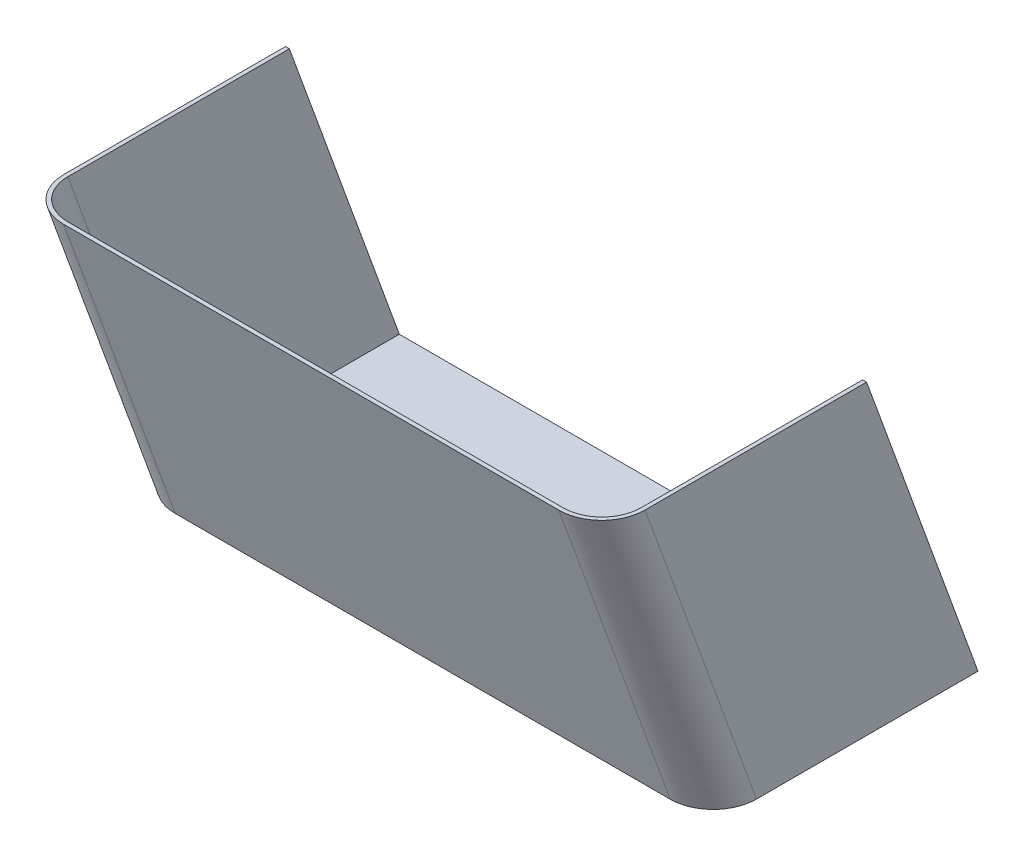
ISO-10303-21;
HEADER;
FILE_DESCRIPTION(('STEP AP214'),'2;1');
FILE_NAME('part.step','',(''),(''),'','','');
FILE_SCHEMA(('AUTOMOTIVE_DESIGN { 1 0 10303 214 1 1 1 1 }'));
ENDSEC;
DATA;
#1=APPLICATION_CONTEXT('core data for automotive mechanical design processes');
#2=APPLICATION_PROTOCOL_DEFINITION('international standard','automotive_design',2000,#1);
#3=PRODUCT_CONTEXT('',#1,'mechanical');
#4=PRODUCT('Part','Part','',(#3));
#5=PRODUCT_RELATED_PRODUCT_CATEGORY('part','',(#4));
#6=PRODUCT_DEFINITION_FORMATION('','',#4);
#7=PRODUCT_DEFINITION_CONTEXT('part definition',#1,'design');
#8=PRODUCT_DEFINITION('design','',#6,#7);
#9=PRODUCT_DEFINITION_SHAPE('','',#8);
#10=(LENGTH_UNIT() NAMED_UNIT(*) SI_UNIT(.MILLI.,.METRE.));
#11=(NAMED_UNIT(*) PLANE_ANGLE_UNIT() SI_UNIT($,.RADIAN.));
#12=(NAMED_UNIT(*) SI_UNIT($,.STERADIAN.) SOLID_ANGLE_UNIT());
#13=UNCERTAINTY_MEASURE_WITH_UNIT(LENGTH_MEASURE(1.E-05),#10,'distance_accuracy_value','');
#14=(GEOMETRIC_REPRESENTATION_CONTEXT(3) GLOBAL_UNCERTAINTY_ASSIGNED_CONTEXT((#13)) GLOBAL_UNIT_ASSIGNED_CONTEXT((#10,
#11,#12)) REPRESENTATION_CONTEXT('',''));
#15=CARTESIAN_POINT('',(0.,0.,0.));
#16=DIRECTION('',(0.,0.,1.));
#17=DIRECTION('',(1.,0.,0.));
#18=AXIS2_PLACEMENT_3D('',#15,#16,#17);
#19=CARTESIAN_POINT('',(220.,3.,70.));
#20=DIRECTION('',(-1.,0.,0.));
#21=DIRECTION('',(0.,0.,1.));
#22=AXIS2_PLACEMENT_3D('',#19,#20,#21);
#23=PLANE('',#22);
#24=DIRECTION('',(0.,0.,-1.));
#25=VECTOR('',#24,1.);
#26=CARTESIAN_POINT('',(220.,0.,70.));
#27=LINE('',#26,#25);
#28=CARTESIAN_POINT('',(220.,0.,70.));
#29=VERTEX_POINT('',#28);
#30=CARTESIAN_POINT('',(220.,0.,-100.));
#31=VERTEX_POINT('',#30);
#32=EDGE_CURVE('E124',#29,#31,#27,.T.);
#33=ORIENTED_EDGE('',*,*,#32,.T.);
#34=DIRECTION('',(0.,0.939692620785909,0.342020143325666));
#35=VECTOR('',#34,1.);
#36=CARTESIAN_POINT('',(220.,57.286013488034,-79.1495962505837));
#37=LINE('',#36,#35);
#38=CARTESIAN_POINT('',(220.,3.,-98.9080892972014));
#39=VERTEX_POINT('',#38);
#40=EDGE_CURVE('E118',#31,#39,#37,.T.);
#41=ORIENTED_EDGE('',*,*,#40,.T.);
#42=DIRECTION('',(0.,0.,-1.));
#43=VECTOR('',#42,1.);
#44=CARTESIAN_POINT('',(220.,3.,70.));
#45=LINE('',#44,#43);
#46=CARTESIAN_POINT('',(220.,3.,70.));
#47=VERTEX_POINT('',#46);
#48=EDGE_CURVE('E139',#47,#39,#45,.T.);
#49=ORIENTED_EDGE('',*,*,#48,.F.);
#50=DIRECTION('',(0.,-1.,0.));
#51=VECTOR('',#50,1.);
#52=CARTESIAN_POINT('',(220.,3.,70.));
#53=LINE('',#52,#51);
#54=EDGE_CURVE('E140',#47,#29,#53,.T.);
#55=ORIENTED_EDGE('',*,*,#54,.T.);
#56=EDGE_LOOP('',(#33,#41,#49,#55));
#57=FACE_BOUND('',#56,.T.);
#58=ADVANCED_FACE('F51',(#57),#23,.F.);
#59=CARTESIAN_POINT('',(-220.,3.,70.));
#60=DIRECTION('',(1.,0.,0.));
#61=DIRECTION('',(0.,0.,-1.));
#62=AXIS2_PLACEMENT_3D('',#59,#60,#61);
#63=PLANE('',#62);
#64=DIRECTION('',(0.,0.,1.));
#65=VECTOR('',#64,1.);
#66=CARTESIAN_POINT('',(-220.,3.,70.));
#67=LINE('',#66,#65);
#68=CARTESIAN_POINT('',(-220.,3.,-98.9080892972014));
#69=VERTEX_POINT('',#68);
#70=CARTESIAN_POINT('',(-220.,3.,70.));
#71=VERTEX_POINT('',#70);
#72=EDGE_CURVE('E101',#69,#71,#67,.T.);
#73=ORIENTED_EDGE('',*,*,#72,.F.);
#74=DIRECTION('',(0.,-0.939692620785909,-0.342020143325666));
#75=VECTOR('',#74,1.);
#76=CARTESIAN_POINT('',(-220.,57.286013488034,-79.1495962505837));
#77=LINE('',#76,#75);
#78=CARTESIAN_POINT('',(-220.,0.,-100.));
#79=VERTEX_POINT('',#78);
#80=EDGE_CURVE('E116',#69,#79,#77,.T.);
#81=ORIENTED_EDGE('',*,*,#80,.T.);
#82=DIRECTION('',(0.,0.,1.));
#83=VECTOR('',#82,1.);
#84=CARTESIAN_POINT('',(-220.,0.,70.));
#85=LINE('',#84,#83);
#86=CARTESIAN_POINT('',(-220.,0.,70.));
#87=VERTEX_POINT('',#86);
#88=EDGE_CURVE('E123',#79,#87,#85,.T.);
#89=ORIENTED_EDGE('',*,*,#88,.T.);
#90=DIRECTION('',(0.,-1.,0.));
#91=VECTOR('',#90,1.);
#92=CARTESIAN_POINT('',(-220.,3.,70.));
#93=LINE('',#92,#91);
#94=EDGE_CURVE('E12',#71,#87,#93,.T.);
#95=ORIENTED_EDGE('',*,*,#94,.F.);
#96=EDGE_LOOP('',(#73,#81,#89,#95));
#97=FACE_BOUND('',#96,.T.);
#98=ADVANCED_FACE('F127',(#97),#63,.F.);
#99=CARTESIAN_POINT('',(-190.,3.,70.));
#100=DIRECTION('',(0.,-1.,0.));
#101=DIRECTION('',(0.,0.,-1.));
#102=AXIS2_PLACEMENT_3D('',#99,#100,#101);
#103=CYLINDRICAL_SURFACE('',#102,30.);
#104=CARTESIAN_POINT('',(-190.,0.,70.));
#105=DIRECTION('',(0.,1.,0.));
#106=DIRECTION('',(0.,0.,-1.));
#107=AXIS2_PLACEMENT_3D('',#104,#105,#106);
#108=CIRCLE('',#107,30.);
#109=CARTESIAN_POINT('',(-190.,0.,100.));
#110=VERTEX_POINT('',#109);
#111=EDGE_CURVE('E132',#87,#110,#108,.T.);
#112=ORIENTED_EDGE('',*,*,#111,.T.);
#113=DIRECTION('',(0.,-1.,0.));
#114=VECTOR('',#113,1.);
#115=CARTESIAN_POINT('',(-190.,3.,100.));
#116=LINE('',#115,#114);
#117=CARTESIAN_POINT('',(-190.,3.,100.));
#118=VERTEX_POINT('',#117);
#119=EDGE_CURVE('E59',#118,#110,#116,.T.);
#120=ORIENTED_EDGE('',*,*,#119,.F.);
#121=CARTESIAN_POINT('',(-190.,3.,70.));
#122=DIRECTION('',(0.,1.,0.));
#123=DIRECTION('',(0.,0.,-1.));
#124=AXIS2_PLACEMENT_3D('',#121,#122,#123);
#125=CIRCLE('',#124,30.);
#126=EDGE_CURVE('E154',#71,#118,#125,.T.);
#127=ORIENTED_EDGE('',*,*,#126,.F.);
#128=ORIENTED_EDGE('',*,*,#94,.T.);
#129=EDGE_LOOP('',(#112,#120,#127,#128));
#130=FACE_BOUND('',#129,.T.);
#131=ADVANCED_FACE('F169',(#130),#103,.T.);
#132=CARTESIAN_POINT('',(-190.,3.,100.));
#133=DIRECTION('',(0.,0.,-1.));
#134=DIRECTION('',(-1.,0.,0.));
#135=AXIS2_PLACEMENT_3D('',#132,#133,#134);
#136=PLANE('',#135);
#137=DIRECTION('',(1.,0.,0.));
#138=VECTOR('',#137,1.);
#139=CARTESIAN_POINT('',(-190.,0.,100.));
#140=LINE('',#139,#138);
#141=CARTESIAN_POINT('',(190.,0.,100.));
#142=VERTEX_POINT('',#141);
#143=EDGE_CURVE('E88',#110,#142,#140,.T.);
#144=ORIENTED_EDGE('',*,*,#143,.T.);
#145=DIRECTION('',(0.,-1.,0.));
#146=VECTOR('',#145,1.);
#147=CARTESIAN_POINT('',(190.,3.,100.));
#148=LINE('',#147,#146);
#149=CARTESIAN_POINT('',(190.,3.,100.));
#150=VERTEX_POINT('',#149);
#151=EDGE_CURVE('E142',#150,#142,#148,.T.);
#152=ORIENTED_EDGE('',*,*,#151,.F.);
#153=DIRECTION('',(1.,0.,0.));
#154=VECTOR('',#153,1.);
#155=CARTESIAN_POINT('',(-190.,3.,100.));
#156=LINE('',#155,#154);
#157=EDGE_CURVE('E146',#118,#150,#156,.T.);
#158=ORIENTED_EDGE('',*,*,#157,.F.);
#159=ORIENTED_EDGE('',*,*,#119,.T.);
#160=EDGE_LOOP('',(#144,#152,#158,#159));
#161=FACE_BOUND('',#160,.T.);
#162=ADVANCED_FACE('F145',(#161),#136,.F.);
#163=CARTESIAN_POINT('',(190.,3.,70.));
#164=DIRECTION('',(0.,-1.,0.));
#165=DIRECTION('',(0.,0.,-1.));
#166=AXIS2_PLACEMENT_3D('',#163,#164,#165);
#167=CYLINDRICAL_SURFACE('',#166,30.);
#168=CARTESIAN_POINT('',(190.,0.,70.));
#169=DIRECTION('',(0.,1.,0.));
#170=DIRECTION('',(0.,0.,-1.));
#171=AXIS2_PLACEMENT_3D('',#168,#169,#170);
#172=CIRCLE('',#171,30.);
#173=EDGE_CURVE('E94',#142,#29,#172,.T.);
#174=ORIENTED_EDGE('',*,*,#173,.T.);
#175=ORIENTED_EDGE('',*,*,#54,.F.);
#176=CARTESIAN_POINT('',(190.,3.,70.));
#177=DIRECTION('',(0.,1.,0.));
#178=DIRECTION('',(0.,0.,-1.));
#179=AXIS2_PLACEMENT_3D('',#176,#177,#178);
#180=CIRCLE('',#179,30.);
#181=EDGE_CURVE('E67',#150,#47,#180,.T.);
#182=ORIENTED_EDGE('',*,*,#181,.F.);
#183=ORIENTED_EDGE('',*,*,#151,.T.);
#184=EDGE_LOOP('',(#174,#175,#182,#183));
#185=FACE_BOUND('',#184,.T.);
#186=ADVANCED_FACE('F160',(#185),#167,.T.);
#187=CARTESIAN_POINT('',(-190.,3.,70.));
#188=DIRECTION('',(0.,-1.,0.));
#189=DIRECTION('',(0.,0.,-1.));
#190=AXIS2_PLACEMENT_3D('',#187,#188,#189);
#191=PLANE('',#190);
#192=ORIENTED_EDGE('',*,*,#48,.T.);
#193=DIRECTION('',(-1.,0.,0.));
#194=VECTOR('',#193,1.);
#195=CARTESIAN_POINT('',(-190.,3.,-98.9080892972014));
#196=LINE('',#195,#194);
#197=EDGE_CURVE('E128',#39,#69,#196,.T.);
#198=ORIENTED_EDGE('',*,*,#197,.T.);
#199=ORIENTED_EDGE('',*,*,#72,.T.);
#200=ORIENTED_EDGE('',*,*,#126,.T.);
#201=ORIENTED_EDGE('',*,*,#157,.T.);
#202=ORIENTED_EDGE('',*,*,#181,.T.);
#203=EDGE_LOOP('',(#192,#198,#199,#200,#201,#202));
#204=FACE_BOUND('',#203,.T.);
#205=ADVANCED_FACE('F158',(#204),#191,.F.);
#206=CARTESIAN_POINT('',(-190.,0.,70.));
#207=DIRECTION('',(0.,-1.,0.));
#208=DIRECTION('',(0.,0.,-1.));
#209=AXIS2_PLACEMENT_3D('',#206,#207,#208);
#210=PLANE('',#209);
#211=ORIENTED_EDGE('',*,*,#32,.F.);
#212=ORIENTED_EDGE('',*,*,#173,.F.);
#213=ORIENTED_EDGE('',*,*,#143,.F.);
#214=ORIENTED_EDGE('',*,*,#111,.F.);
#215=ORIENTED_EDGE('',*,*,#88,.F.);
#216=DIRECTION('',(-1.,0.,0.));
#217=VECTOR('',#216,1.);
#218=CARTESIAN_POINT('',(-220.,0.,-100.));
#219=LINE('',#218,#217);
#220=EDGE_CURVE('E113',#31,#79,#219,.T.);
#221=ORIENTED_EDGE('',*,*,#220,.F.);
#222=EDGE_LOOP('',(#211,#212,#213,#214,#215,#221));
#223=FACE_BOUND('',#222,.T.);
#224=ADVANCED_FACE('F131',(#223),#210,.T.);
#225=CARTESIAN_POINT('',(0.,32.1393804843268,-88.3022221559491));
#226=DIRECTION('',(0.,-0.342020143325666,0.939692620785909));
#227=DIRECTION('',(0.,-0.939692620785909,-0.342020143325666));
#228=AXIS2_PLACEMENT_3D('',#225,#226,#227);
#229=PLANE('',#228);
#230=ORIENTED_EDGE('',*,*,#220,.T.);
#231=ORIENTED_EDGE('',*,*,#80,.F.);
#232=ORIENTED_EDGE('',*,*,#197,.F.);
#233=ORIENTED_EDGE('',*,*,#40,.F.);
#234=EDGE_LOOP('',(#230,#231,#232,#233));
#235=FACE_BOUND('',#234,.T.);
#236=ADVANCED_FACE('F115',(#235),#229,.F.);
#237=CLOSED_SHELL('',(#58,#98,#131,#162,#186,#205,#224,#236));
#238=MANIFOLD_SOLID_BREP('B2',#237);
#239=CARTESIAN_POINT('',(-190.,0.,70.));
#240=DIRECTION('',(0.,-1.,0.));
#241=DIRECTION('',(0.,0.,-1.));
#242=AXIS2_PLACEMENT_3D('',#239,#240,#241);
#243=PLANE('',#242);
#244=DIRECTION('',(-1.,0.,0.));
#245=VECTOR('',#244,1.);
#246=CARTESIAN_POINT('',(-190.,0.,-100.));
#247=LINE('',#246,#245);
#248=CARTESIAN_POINT('',(223.,0.,-100.));
#249=VERTEX_POINT('',#248);
#250=CARTESIAN_POINT('',(220.,0.,-100.));
#251=VERTEX_POINT('',#250);
#252=EDGE_CURVE('E462',#249,#251,#247,.T.);
#253=ORIENTED_EDGE('',*,*,#252,.F.);
#254=DIRECTION('',(0.,0.,-1.));
#255=VECTOR('',#254,1.);
#256=CARTESIAN_POINT('',(223.,0.,70.));
#257=LINE('',#256,#255);
#258=CARTESIAN_POINT('',(223.,0.,70.));
#259=VERTEX_POINT('',#258);
#260=EDGE_CURVE('E387',#259,#249,#257,.T.);
#261=ORIENTED_EDGE('',*,*,#260,.F.);
#262=CARTESIAN_POINT('',(190.,0.,103.192533317428));
#263=CARTESIAN_POINT('',(190.681583223475,0.,103.192563614538));
#264=CARTESIAN_POINT('',(191.363162488784,0.,103.171301897537));
#265=CARTESIAN_POINT('',(192.723678447335,0.,103.086412557612));
#266=CARTESIAN_POINT('',(193.402615139459,0.,103.022784916773));
#267=CARTESIAN_POINT('',(194.755219531054,0.,102.853380747662));
#268=CARTESIAN_POINT('',(195.428887161724,0.,102.74760366996));
#269=CARTESIAN_POINT('',(196.766991113159,0.,102.494587616721));
#270=CARTESIAN_POINT('',(197.431443204615,0.,102.347432005655));
#271=CARTESIAN_POINT('',(198.749898299227,0.,102.012158713157));
#272=CARTESIAN_POINT('',(199.403901931649,0.,101.824043508603));
#273=CARTESIAN_POINT('',(200.698877707023,0.,101.407634863106));
#274=CARTESIAN_POINT('',(201.33985118425,0.,101.179345559308));
#275=CARTESIAN_POINT('',(202.832940544043,0.,100.594753636475));
#276=CARTESIAN_POINT('',(203.678622362958,0.,100.221862637799));
#277=CARTESIAN_POINT('',(205.335538241356,0.,99.4063670141976));
#278=CARTESIAN_POINT('',(206.146774296843,0.,98.9637664357058));
#279=CARTESIAN_POINT('',(207.728998886027,0.,98.0121621466887));
#280=CARTESIAN_POINT('',(208.499999586463,0.,97.5031786744604));
#281=CARTESIAN_POINT('',(209.996627087777,0.,96.422373820473));
#282=CARTESIAN_POINT('',(210.722253278021,0.,95.8505515933351));
#283=CARTESIAN_POINT('',(212.125526763354,0.,94.6460852987494));
#284=CARTESIAN_POINT('',(212.802998694628,0.,94.0132369147941));
#285=CARTESIAN_POINT('',(214.102473754947,0.,92.6929465644409));
#286=CARTESIAN_POINT('',(214.724476644,0.,92.0055043618631));
#287=CARTESIAN_POINT('',(215.908914995761,0.,90.580707720469));
#288=CARTESIAN_POINT('',(216.471330773188,0.,89.8433369182197));
#289=CARTESIAN_POINT('',(217.532493241485,0.,88.3241437200414));
#290=CARTESIAN_POINT('',(218.031240856023,0.,87.5423219692237));
#291=CARTESIAN_POINT('',(218.964313957741,0.,85.9352085228399));
#292=CARTESIAN_POINT('',(219.398258666318,0.,85.1096957486953));
#293=CARTESIAN_POINT('',(220.195386429831,0.,83.4251004962271));
#294=CARTESIAN_POINT('',(220.558563831107,0.,82.5660153423545));
#295=CARTESIAN_POINT('',(221.211414486966,0.,80.8210505823467));
#296=CARTESIAN_POINT('',(221.501137275791,0.,79.9351894862078));
#297=CARTESIAN_POINT('',(222.005380726449,0.,78.1424934098582));
#298=CARTESIAN_POINT('',(222.219923791343,0.,77.2356647638501));
#299=CARTESIAN_POINT('',(222.496608359639,0.,75.8007705268414));
#300=CARTESIAN_POINT('',(222.584610120449,0.,75.2775519135155));
#301=CARTESIAN_POINT('',(222.735594732852,0.,74.227461640689));
#302=CARTESIAN_POINT('',(222.798576629615,0.,73.7005898425531));
#303=CARTESIAN_POINT('',(222.899278031322,0.,72.6453523423239));
#304=CARTESIAN_POINT('',(222.937040386273,0.,72.1169907138074));
#305=CARTESIAN_POINT('',(222.987405434408,0.,71.0590877142266));
#306=CARTESIAN_POINT('',(223.000008980553,0.,70.5295463837674));
#307=CARTESIAN_POINT('',(223.,0.,70.));
#308=B_SPLINE_CURVE_WITH_KNOTS('',3,(#262,#263,#264,#265,#266,#267,#268,#269,#270,#271,#272,
#273,#274,#275,#276,#277,#278,#279,#280,#281,#282,#283,#284,#285,#286,#287,#288,#289,#290,#291,
#292,#293,#294,#295,#296,#297,#298,#299,#300,#301,#302,#303,#304,#305,#306,#307),.UNSPECIFIED.,
.F.,.F.,(4,2,2,2,2,2,2,2,2,2,2,2,2,2,2,2,2,2,2,2,2,2,4),(0.,2.04441220519643,4.08882527490304,
6.13326499505343,8.17361497827645,10.213841613201,12.2538582675647,15.0231565841596,
17.7922942104266,20.5605895685717,23.3289221735489,26.1068681955566,28.8848262359753,
31.6636991635032,34.442531771869,37.2370993814557,40.0318901599688,42.8247912235253,
45.6168593119143,47.2080425326876,48.7992864716699,50.3878198351839,51.9762993415501),.UNSPECIFIED.);
#309=CARTESIAN_POINT('',(190.,0.,103.192533317428));
#310=VERTEX_POINT('',#309);
#311=EDGE_CURVE('E391',#310,#259,#308,.T.);
#312=ORIENTED_EDGE('',*,*,#311,.F.);
#313=DIRECTION('',(1.,0.,0.));
#314=VECTOR('',#313,1.);
#315=CARTESIAN_POINT('',(-190.,0.,103.192533317428));
#316=LINE('',#315,#314);
#317=CARTESIAN_POINT('',(-190.,0.,103.192533317428));
#318=VERTEX_POINT('',#317);
#319=EDGE_CURVE('E399',#318,#310,#316,.T.);
#320=ORIENTED_EDGE('',*,*,#319,.F.);
#321=CARTESIAN_POINT('',(-223.,0.,70.));
#322=CARTESIAN_POINT('',(-223.000024418141,0.,70.6671989562748));
#323=CARTESIAN_POINT('',(-222.98000735055,0.,71.3343942706616));
#324=CARTESIAN_POINT('',(-222.900066471554,0.,72.6663962878826));
#325=CARTESIAN_POINT('',(-222.840142297123,0.,73.3312029689328));
#326=CARTESIAN_POINT('',(-222.680562578487,0.,74.6560413022945));
#327=CARTESIAN_POINT('',(-222.580906606258,0.,75.3160729030869));
#328=CARTESIAN_POINT('',(-222.342361336454,0.,76.628187587564));
#329=CARTESIAN_POINT('',(-222.203518698962,0.,77.2802791680428));
#330=CARTESIAN_POINT('',(-221.887019156481,0.,78.574986343117));
#331=CARTESIAN_POINT('',(-221.709364059401,0.,79.2176023776014));
#332=CARTESIAN_POINT('',(-221.414284200944,0.,80.1725416193163));
#333=CARTESIAN_POINT('',(-221.311162044975,0.,80.4893465949502));
#334=CARTESIAN_POINT('',(-221.095446150978,0.,81.1197884983636));
#335=CARTESIAN_POINT('',(-220.982850238968,0.,81.4334246803916));
#336=CARTESIAN_POINT('',(-220.535322294105,0.,82.6235246883577));
#337=CARTESIAN_POINT('',(-220.167867214329,0.,83.488021389557));
#338=CARTESIAN_POINT('',(-219.36116408959,0.,85.1829264736672));
#339=CARTESIAN_POINT('',(-218.921908090418,0.,86.0133310670385));
#340=CARTESIAN_POINT('',(-218.211703534129,0.,87.2285446223304));
#341=CARTESIAN_POINT('',(-217.966422642633,0.,87.6285397604552));
#342=CARTESIAN_POINT('',(-217.459193642902,0.,88.417693261195));
#343=CARTESIAN_POINT('',(-217.197250200255,0.,88.8068546138227));
#344=CARTESIAN_POINT('',(-216.657072792597,0.,89.5737646397708));
#345=CARTESIAN_POINT('',(-216.378837122781,0.,89.9515121124595));
#346=CARTESIAN_POINT('',(-215.806593674762,0.,90.6948700992532));
#347=CARTESIAN_POINT('',(-215.512584760354,0.,91.0604797359463));
#348=CARTESIAN_POINT('',(-214.610142565834,0.,92.135118818105));
#349=CARTESIAN_POINT('',(-213.978955984583,0.,92.8252759764683));
#350=CARTESIAN_POINT('',(-212.660529887528,0.,94.1496151245058));
#351=CARTESIAN_POINT('',(-211.973290264594,0.,94.7837970071942));
#352=CARTESIAN_POINT('',(-210.547321373132,0.,95.9918408619635));
#353=CARTESIAN_POINT('',(-209.808577855457,0.,96.5656860301815));
#354=CARTESIAN_POINT('',(-208.28506902679,0.,97.6485861711776));
#355=CARTESIAN_POINT('',(-207.5003047504,0.,98.1576425996702));
#356=CARTESIAN_POINT('',(-205.894761898193,0.,99.1046245497082));
#357=CARTESIAN_POINT('',(-205.074203899524,0.,99.5429240700552));
#358=CARTESIAN_POINT('',(-203.398871988912,0.,100.348551725607));
#359=CARTESIAN_POINT('',(-202.544095586247,0.,100.715874683121));
#360=CARTESIAN_POINT('',(-200.807162436983,0.,101.376554999095));
#361=CARTESIAN_POINT('',(-199.925026079338,0.,101.669966017649));
#362=CARTESIAN_POINT('',(-198.139229617934,0.,102.180945928003));
#363=CARTESIAN_POINT('',(-197.235576133778,0.,102.398537831065));
#364=CARTESIAN_POINT('',(-195.803659922468,0.,102.679708168742));
#365=CARTESIAN_POINT('',(-195.280370916332,0.,102.769336408949));
#366=CARTESIAN_POINT('',(-194.230006785146,0.,102.923128840063));
#367=CARTESIAN_POINT('',(-193.702931510295,0.,102.987292017757));
#368=CARTESIAN_POINT('',(-192.647156992719,0.,103.089893778368));
#369=CARTESIAN_POINT('',(-192.118461781616,0.,103.128374000952));
#370=CARTESIAN_POINT('',(-191.059846171348,0.,103.179698468916));
#371=CARTESIAN_POINT('',(-190.529925813329,0.,103.192543563048));
#372=CARTESIAN_POINT('',(-190.,0.,103.192533317428));
#373=B_SPLINE_CURVE_WITH_KNOTS('',3,(#321,#322,#323,#324,#325,#326,#327,#328,#329,#330,#331,
#332,#333,#334,#335,#336,#337,#338,#339,#340,#341,#342,#343,#344,#345,#346,#347,#348,#349,#350,
#351,#352,#353,#354,#355,#356,#357,#358,#359,#360,#361,#362,#363,#364,#365,#366,#367,#368,#369,
#370,#371,#372),.UNSPECIFIED.,.F.,.F.,(4,2,2,2,2,2,2,2,2,2,2,2,2,2,2,2,2,2,2,2,2,2,2,2,2,4),(0.,
2.00129075953658,4.00259972452669,6.00393024987113,8.00288774573742,10.0017521487942,
11.0011162809766,12.0007103699343,14.8151078452563,17.6298173151675,19.0370953162504,
20.4439809932781,21.8510141497263,23.2581487963685,26.0602816700112,28.862419899267,
31.66533647246,34.4681900568207,37.2557058686434,40.0434249510663,42.8291142773775,
45.6139574031349,47.2061459464425,48.798397834012,50.3880618984762,51.977673329969),.UNSPECIFIED.);
#374=CARTESIAN_POINT('',(-223.,0.,70.));
#375=VERTEX_POINT('',#374);
#376=EDGE_CURVE('E317',#375,#318,#373,.T.);
#377=ORIENTED_EDGE('',*,*,#376,.F.);
#378=DIRECTION('',(0.,0.,1.));
#379=VECTOR('',#378,1.);
#380=CARTESIAN_POINT('',(-223.,0.,70.));
#381=LINE('',#380,#379);
#382=CARTESIAN_POINT('',(-223.,0.,-100.));
#383=VERTEX_POINT('',#382);
#384=EDGE_CURVE('E231',#383,#375,#381,.T.);
#385=ORIENTED_EDGE('',*,*,#384,.F.);
#386=CARTESIAN_POINT('',(-220.,0.,-100.));
#387=VERTEX_POINT('',#386);
#388=EDGE_CURVE('E478',#387,#383,#247,.T.);
#389=ORIENTED_EDGE('',*,*,#388,.F.);
#390=DIRECTION('',(0.,0.,1.));
#391=VECTOR('',#390,1.);
#392=CARTESIAN_POINT('',(-220.,0.,70.));
#393=LINE('',#392,#391);
#394=CARTESIAN_POINT('',(-220.,0.,70.));
#395=VERTEX_POINT('',#394);
#396=EDGE_CURVE('E450',#387,#395,#393,.T.);
#397=ORIENTED_EDGE('',*,*,#396,.T.);
#398=CARTESIAN_POINT('',(-190.,0.,70.));
#399=DIRECTION('',(0.,1.,0.));
#400=DIRECTION('',(0.,0.,-1.));
#401=AXIS2_PLACEMENT_3D('',#398,#399,#400);
#402=CIRCLE('',#401,30.);
#403=CARTESIAN_POINT('',(-190.,0.,100.));
#404=VERTEX_POINT('',#403);
#405=EDGE_CURVE('E439',#395,#404,#402,.T.);
#406=ORIENTED_EDGE('',*,*,#405,.T.);
#407=DIRECTION('',(1.,0.,0.));
#408=VECTOR('',#407,1.);
#409=CARTESIAN_POINT('',(-190.,0.,100.));
#410=LINE('',#409,#408);
#411=CARTESIAN_POINT('',(190.,0.,100.));
#412=VERTEX_POINT('',#411);
#413=EDGE_CURVE('E429',#404,#412,#410,.T.);
#414=ORIENTED_EDGE('',*,*,#413,.T.);
#415=CARTESIAN_POINT('',(190.,0.,70.));
#416=DIRECTION('',(0.,1.,0.));
#417=DIRECTION('',(0.,0.,-1.));
#418=AXIS2_PLACEMENT_3D('',#415,#416,#417);
#419=CIRCLE('',#418,30.);
#420=CARTESIAN_POINT('',(220.,0.,70.));
#421=VERTEX_POINT('',#420);
#422=EDGE_CURVE('E422',#412,#421,#419,.T.);
#423=ORIENTED_EDGE('',*,*,#422,.T.);
#424=DIRECTION('',(0.,0.,-1.));
#425=VECTOR('',#424,1.);
#426=CARTESIAN_POINT('',(220.,0.,70.));
#427=LINE('',#426,#425);
#428=EDGE_CURVE('E418',#421,#251,#427,.T.);
#429=ORIENTED_EDGE('',*,*,#428,.T.);
#430=EDGE_LOOP('',(#253,#261,#312,#320,#377,#385,#389,#397,#406,#414,#423,#429));
#431=FACE_BOUND('',#430,.T.);
#432=ADVANCED_FACE('F227',(#431),#243,.T.);
#433=CARTESIAN_POINT('',(-190.,234.923155196477,155.505035831417));
#434=DIRECTION('',(0.,-1.,0.));
#435=DIRECTION('',(0.,0.,-1.));
#436=AXIS2_PLACEMENT_3D('',#433,#434,#435);
#437=PLANE('',#436);
#438=DIRECTION('',(0.,0.,-1.));
#439=VECTOR('',#438,1.);
#440=CARTESIAN_POINT('',(223.,234.923155196477,70.));
#441=LINE('',#440,#439);
#442=CARTESIAN_POINT('',(223.,234.923155196477,155.505035831417));
#443=VERTEX_POINT('',#442);
#444=CARTESIAN_POINT('',(223.,234.923155196477,-14.4949641685835));
#445=VERTEX_POINT('',#444);
#446=EDGE_CURVE('E49',#443,#445,#441,.T.);
#447=ORIENTED_EDGE('',*,*,#446,.T.);
#448=DIRECTION('',(-1.,0.,0.));
#449=VECTOR('',#448,1.);
#450=CARTESIAN_POINT('',(-190.,234.923155196477,-14.4949641685835));
#451=LINE('',#450,#449);
#452=CARTESIAN_POINT('',(220.,234.923155196477,-14.4949641685835));
#453=VERTEX_POINT('',#452);
#454=EDGE_CURVE('E473',#445,#453,#451,.T.);
#455=ORIENTED_EDGE('',*,*,#454,.T.);
#456=DIRECTION('',(0.,0.,-1.));
#457=VECTOR('',#456,1.);
#458=CARTESIAN_POINT('',(220.,234.923155196477,155.505035831417));
#459=LINE('',#458,#457);
#460=CARTESIAN_POINT('',(220.,234.923155196477,155.505035831417));
#461=VERTEX_POINT('',#460);
#462=EDGE_CURVE('E407',#461,#453,#459,.T.);
#463=ORIENTED_EDGE('',*,*,#462,.F.);
#464=CARTESIAN_POINT('',(190.,234.923155196477,155.505035831417));
#465=DIRECTION('',(0.,1.,0.));
#466=DIRECTION('',(0.,0.,-1.));
#467=AXIS2_PLACEMENT_3D('',#464,#465,#466);
#468=CIRCLE('',#467,30.);
#469=CARTESIAN_POINT('',(190.,234.923155196477,185.505035831417));
#470=VERTEX_POINT('',#469);
#471=EDGE_CURVE('E280',#470,#461,#468,.T.);
#472=ORIENTED_EDGE('',*,*,#471,.F.);
#473=DIRECTION('',(1.,0.,0.));
#474=VECTOR('',#473,1.);
#475=CARTESIAN_POINT('',(-190.,234.923155196477,185.505035831417));
#476=LINE('',#475,#474);
#477=CARTESIAN_POINT('',(-190.,234.923155196477,185.505035831417));
#478=VERTEX_POINT('',#477);
#479=EDGE_CURVE('E432',#478,#470,#476,.T.);
#480=ORIENTED_EDGE('',*,*,#479,.F.);
#481=CARTESIAN_POINT('',(-190.,234.923155196477,155.505035831417));
#482=DIRECTION('',(0.,1.,0.));
#483=DIRECTION('',(0.,0.,-1.));
#484=AXIS2_PLACEMENT_3D('',#481,#482,#483);
#485=CIRCLE('',#484,30.);
#486=CARTESIAN_POINT('',(-220.,234.923155196477,155.505035831417));
#487=VERTEX_POINT('',#486);
#488=EDGE_CURVE('E443',#487,#478,#485,.T.);
#489=ORIENTED_EDGE('',*,*,#488,.F.);
#490=DIRECTION('',(0.,0.,1.));
#491=VECTOR('',#490,1.);
#492=CARTESIAN_POINT('',(-220.,234.923155196477,155.505035831417));
#493=LINE('',#492,#491);
#494=CARTESIAN_POINT('',(-220.,234.923155196477,-14.4949641685835));
#495=VERTEX_POINT('',#494);
#496=EDGE_CURVE('E454',#495,#487,#493,.T.);
#497=ORIENTED_EDGE('',*,*,#496,.F.);
#498=CARTESIAN_POINT('',(-223.,234.923155196477,-14.4949641685835));
#499=VERTEX_POINT('',#498);
#500=EDGE_CURVE('E484',#495,#499,#451,.T.);
#501=ORIENTED_EDGE('',*,*,#500,.T.);
#502=DIRECTION('',(0.,0.,1.));
#503=VECTOR('',#502,1.);
#504=CARTESIAN_POINT('',(-223.,234.923155196477,70.));
#505=LINE('',#504,#503);
#506=CARTESIAN_POINT('',(-223.,234.923155196477,155.505035831417));
#507=VERTEX_POINT('',#506);
#508=EDGE_CURVE('E298',#499,#507,#505,.T.);
#509=ORIENTED_EDGE('',*,*,#508,.T.);
#510=CARTESIAN_POINT('',(-223.,234.923155196477,155.505035831417));
#511=CARTESIAN_POINT('',(-223.000024418141,234.923155196477,156.172234787691));
#512=CARTESIAN_POINT('',(-222.98000735055,234.923155196477,156.839430102078));
#513=CARTESIAN_POINT('',(-222.900066471554,234.923155196477,158.171432119299));
#514=CARTESIAN_POINT('',(-222.840142297123,234.923155196477,158.836238800349));
#515=CARTESIAN_POINT('',(-222.680562578487,234.923155196477,160.161077133711));
#516=CARTESIAN_POINT('',(-222.580906606258,234.923155196477,160.821108734503));
#517=CARTESIAN_POINT('',(-222.342361336454,234.923155196477,162.133223418981));
#518=CARTESIAN_POINT('',(-222.203518698962,234.923155196477,162.785314999459));
#519=CARTESIAN_POINT('',(-221.887019156481,234.923155196477,164.080022174534));
#520=CARTESIAN_POINT('',(-221.709364059401,234.923155196477,164.722638209018));
#521=CARTESIAN_POINT('',(-221.414284200944,234.923155196477,165.677577450733));
#522=CARTESIAN_POINT('',(-221.311162044975,234.923155196477,165.994382426367));
#523=CARTESIAN_POINT('',(-221.095446150977,234.923155196477,166.62482432978));
#524=CARTESIAN_POINT('',(-220.982850238968,234.923155196477,166.938460511808));
#525=CARTESIAN_POINT('',(-220.535322294105,234.923155196477,168.128560519774));
#526=CARTESIAN_POINT('',(-220.167867214329,234.923155196477,168.993057220973));
#527=CARTESIAN_POINT('',(-219.36116408959,234.923155196477,170.687962305084));
#528=CARTESIAN_POINT('',(-218.921908090418,234.923155196477,171.518366898455));
#529=CARTESIAN_POINT('',(-218.211703534129,234.923155196477,172.733580453747));
#530=CARTESIAN_POINT('',(-217.966422642633,234.923155196477,173.133575591872));
#531=CARTESIAN_POINT('',(-217.459193642902,234.923155196477,173.922729092611));
#532=CARTESIAN_POINT('',(-217.197250200255,234.923155196477,174.311890445239));
#533=CARTESIAN_POINT('',(-216.657072792597,234.923155196477,175.078800471187));
#534=CARTESIAN_POINT('',(-216.378837122781,234.923155196477,175.456547943876));
#535=CARTESIAN_POINT('',(-215.806593674762,234.923155196477,176.19990593067));
#536=CARTESIAN_POINT('',(-215.512584760354,234.923155196477,176.565515567363));
#537=CARTESIAN_POINT('',(-214.610142565835,234.923155196477,177.640154649522));
#538=CARTESIAN_POINT('',(-213.978955984583,234.923155196477,178.330311807885));
#539=CARTESIAN_POINT('',(-212.660529887528,234.923155196477,179.654650955922));
#540=CARTESIAN_POINT('',(-211.973290264595,234.923155196477,180.288832838611));
#541=CARTESIAN_POINT('',(-210.547321373132,234.923155196477,181.49687669338));
#542=CARTESIAN_POINT('',(-209.808577855457,234.923155196477,182.070721861598));
#543=CARTESIAN_POINT('',(-208.28506902679,234.923155196477,183.153622002594));
#544=CARTESIAN_POINT('',(-207.5003047504,234.923155196477,183.662678431087));
#545=CARTESIAN_POINT('',(-205.894761898193,234.923155196477,184.609660381125));
#546=CARTESIAN_POINT('',(-205.074203899524,234.923155196477,185.047959901472));
#547=CARTESIAN_POINT('',(-203.398871988912,234.923155196477,185.853587557023));
#548=CARTESIAN_POINT('',(-202.544095586247,234.923155196477,186.220910514538));
#549=CARTESIAN_POINT('',(-200.807162436983,234.923155196477,186.881590830512));
#550=CARTESIAN_POINT('',(-199.925026079338,234.923155196477,187.175001849066));
#551=CARTESIAN_POINT('',(-198.139229617934,234.923155196477,187.685981759419));
#552=CARTESIAN_POINT('',(-197.235576133778,234.923155196477,187.903573662482));
#553=CARTESIAN_POINT('',(-195.803659922468,234.923155196477,188.184744000159));
#554=CARTESIAN_POINT('',(-195.280370916332,234.923155196477,188.274372240365));
#555=CARTESIAN_POINT('',(-194.230006785146,234.923155196477,188.42816467148));
#556=CARTESIAN_POINT('',(-193.702931510295,234.923155196477,188.492327849174));
#557=CARTESIAN_POINT('',(-192.647156992719,234.923155196477,188.594929609785));
#558=CARTESIAN_POINT('',(-192.118461781616,234.923155196477,188.633409832368));
#559=CARTESIAN_POINT('',(-191.059846171349,234.923155196477,188.684734300332));
#560=CARTESIAN_POINT('',(-190.529925813329,234.923155196477,188.697579394464));
#561=CARTESIAN_POINT('',(-190.,234.923155196477,188.697569148844));
#562=B_SPLINE_CURVE_WITH_KNOTS('',3,(#510,#511,#512,#513,#514,#515,#516,#517,#518,#519,#520,
#521,#522,#523,#524,#525,#526,#527,#528,#529,#530,#531,#532,#533,#534,#535,#536,#537,#538,#539,
#540,#541,#542,#543,#544,#545,#546,#547,#548,#549,#550,#551,#552,#553,#554,#555,#556,#557,#558,
#559,#560,#561),.UNSPECIFIED.,.F.,.F.,(4,2,2,2,2,2,2,2,2,2,2,2,2,2,2,2,2,2,2,2,2,2,2,2,2,4),(0.,
2.00129075953659,4.00259972452664,6.00393024987109,8.00288774573739,10.0017521487942,
11.0011162809766,12.0007103699342,14.8151078452562,17.6298173151674,19.0370953162503,
20.443980993278,21.8510141497261,23.2581487963684,26.0602816700111,28.8624198992669,
31.6653364724599,34.4681900568206,37.2557058686434,40.0434249510663,42.8291142773775,
45.6139574031349,47.2061459464426,48.798397834012,50.3880618984762,51.977673329969),.UNSPECIFIED.);
#563=CARTESIAN_POINT('',(-190.,234.923155196477,188.697569148844));
#564=VERTEX_POINT('',#563);
#565=EDGE_CURVE('E292',#507,#564,#562,.T.);
#566=ORIENTED_EDGE('',*,*,#565,.T.);
#567=DIRECTION('',(1.,0.,0.));
#568=VECTOR('',#567,1.);
#569=CARTESIAN_POINT('',(-190.,234.923155196477,188.697569148844));
#570=LINE('',#569,#568);
#571=CARTESIAN_POINT('',(190.,234.923155196477,188.697569148844));
#572=VERTEX_POINT('',#571);
#573=EDGE_CURVE('E295',#564,#572,#570,.T.);
#574=ORIENTED_EDGE('',*,*,#573,.T.);
#575=CARTESIAN_POINT('',(190.,234.923155196477,188.697569148844));
#576=CARTESIAN_POINT('',(190.681583223475,234.923155196477,188.697599445954));
#577=CARTESIAN_POINT('',(191.363162488784,234.923155196477,188.676337728954));
#578=CARTESIAN_POINT('',(192.723678447335,234.923155196477,188.591448389029));
#579=CARTESIAN_POINT('',(193.402615139459,234.923155196477,188.527820748189));
#580=CARTESIAN_POINT('',(194.755219531054,234.923155196477,188.358416579079));
#581=CARTESIAN_POINT('',(195.428887161724,234.923155196477,188.252639501376));
#582=CARTESIAN_POINT('',(196.766991113159,234.923155196477,187.999623448137));
#583=CARTESIAN_POINT('',(197.431443204615,234.923155196477,187.852467837072));
#584=CARTESIAN_POINT('',(198.749898299227,234.923155196477,187.517194544574));
#585=CARTESIAN_POINT('',(199.403901931649,234.923155196477,187.32907934002));
#586=CARTESIAN_POINT('',(200.698877707023,234.923155196477,186.912670694523));
#587=CARTESIAN_POINT('',(201.33985118425,234.923155196477,186.684381390725));
#588=CARTESIAN_POINT('',(202.832940544043,234.923155196477,186.099789467891));
#589=CARTESIAN_POINT('',(203.678622362958,234.923155196477,185.726898469216));
#590=CARTESIAN_POINT('',(205.335538241356,234.923155196477,184.911402845614));
#591=CARTESIAN_POINT('',(206.146774296843,234.923155196477,184.468802267122));
#592=CARTESIAN_POINT('',(207.728998886027,234.923155196477,183.517197978105));
#593=CARTESIAN_POINT('',(208.499999586463,234.923155196477,183.008214505877));
#594=CARTESIAN_POINT('',(209.996627087777,234.923155196477,181.92740965189));
#595=CARTESIAN_POINT('',(210.722253278021,234.923155196477,181.355587424752));
#596=CARTESIAN_POINT('',(212.125526763355,234.923155196477,180.151121130166));
#597=CARTESIAN_POINT('',(212.802998694628,234.923155196477,179.518272746211));
#598=CARTESIAN_POINT('',(214.102473754947,234.923155196477,178.197982395857));
#599=CARTESIAN_POINT('',(214.724476644,234.923155196477,177.51054019328));
#600=CARTESIAN_POINT('',(215.908914995762,234.923155196477,176.085743551886));
#601=CARTESIAN_POINT('',(216.471330773188,234.923155196477,175.348372749636));
#602=CARTESIAN_POINT('',(217.532493241485,234.923155196477,173.829179551458));
#603=CARTESIAN_POINT('',(218.031240856023,234.923155196477,173.04735780064));
#604=CARTESIAN_POINT('',(218.964313957741,234.923155196477,171.440244354256));
#605=CARTESIAN_POINT('',(219.398258666318,234.923155196477,170.614731580112));
#606=CARTESIAN_POINT('',(220.195386429831,234.923155196477,168.930136327644));
#607=CARTESIAN_POINT('',(220.558563831107,234.923155196477,168.071051173771));
#608=CARTESIAN_POINT('',(221.211414486966,234.923155196477,166.326086413763));
#609=CARTESIAN_POINT('',(221.501137275791,234.923155196477,165.440225317624));
#610=CARTESIAN_POINT('',(222.005380726449,234.923155196477,163.647529241275));
#611=CARTESIAN_POINT('',(222.219923791342,234.923155196477,162.740700595267));
#612=CARTESIAN_POINT('',(222.496608359639,234.923155196477,161.305806358258));
#613=CARTESIAN_POINT('',(222.584610120449,234.923155196477,160.782587744932));
#614=CARTESIAN_POINT('',(222.735594732852,234.923155196477,159.732497472106));
#615=CARTESIAN_POINT('',(222.798576629615,234.923155196477,159.20562567397));
#616=CARTESIAN_POINT('',(222.899278031322,234.923155196477,158.15038817374));
#617=CARTESIAN_POINT('',(222.937040386273,234.923155196477,157.622026545224));
#618=CARTESIAN_POINT('',(222.987405434408,234.923155196477,156.564123545643));
#619=CARTESIAN_POINT('',(223.000008980553,234.923155196477,156.034582215184));
#620=CARTESIAN_POINT('',(223.,234.923155196477,155.505035831417));
#621=B_SPLINE_CURVE_WITH_KNOTS('',3,(#575,#576,#577,#578,#579,#580,#581,#582,#583,#584,#585,
#586,#587,#588,#589,#590,#591,#592,#593,#594,#595,#596,#597,#598,#599,#600,#601,#602,#603,#604,
#605,#606,#607,#608,#609,#610,#611,#612,#613,#614,#615,#616,#617,#618,#619,#620),.UNSPECIFIED.,
.F.,.F.,(4,2,2,2,2,2,2,2,2,2,2,2,2,2,2,2,2,2,2,2,2,2,4),(0.,2.04441220519646,4.08882527490307,
6.13326499505347,8.17361497827649,10.213841613201,12.2538582675648,15.0231565841596,
17.7922942104266,20.5605895685717,23.3289221735489,26.1068681955567,28.8848262359753,
31.6636991635032,34.442531771869,37.2370993814557,40.0318901599688,42.8247912235253,
45.6168593119143,47.2080425326876,48.79928647167,50.3878198351839,51.9762993415501),.UNSPECIFIED.);
#622=EDGE_CURVE('E253',#572,#443,#621,.T.);
#623=ORIENTED_EDGE('',*,*,#622,.T.);
#624=EDGE_LOOP('',(#447,#455,#463,#472,#480,#489,#497,#501,#509,#566,#574,#623));
#625=FACE_BOUND('',#624,.T.);
#626=ADVANCED_FACE('F294',(#625),#437,.F.);
#627=CARTESIAN_POINT('',(-223.,0.,70.));
#628=DIRECTION('',(-1.,0.,0.));
#629=DIRECTION('',(0.,0.,1.));
#630=AXIS2_PLACEMENT_3D('',#627,#628,#629);
#631=PLANE('',#630);
#632=DIRECTION('',(0.,0.939692620785909,0.342020143325666));
#633=VECTOR('',#632,1.);
#634=CARTESIAN_POINT('',(-223.,54.6369468233555,-80.1137776651135));
#635=LINE('',#634,#633);
#636=EDGE_CURVE('E474',#383,#499,#635,.T.);
#637=ORIENTED_EDGE('',*,*,#636,.F.);
#638=ORIENTED_EDGE('',*,*,#384,.T.);
#639=CARTESIAN_POINT('',(-223.,-5.37112450270756E-10,70.0000000019626));
#640=CARTESIAN_POINT('',(-223.,9.78846479932618,73.562709828244));
#641=CARTESIAN_POINT('',(-223.,19.5769295991761,77.1254196545621));
#642=CARTESIAN_POINT('',(-223.,39.1538591988169,84.2508393071983));
#643=CARTESIAN_POINT('',(-223.,48.9423239986077,87.8135491335164));
#644=CARTESIAN_POINT('',(-223.,68.5192535982545,94.9389687861361));
#645=CARTESIAN_POINT('',(-223.,78.3077183981105,98.5016786124376));
#646=CARTESIAN_POINT('',(-223.,97.8846479978189,105.62709826505));
#647=CARTESIAN_POINT('',(-223.,107.673112797671,109.189808091361));
#648=CARTESIAN_POINT('',(-223.,127.250042397377,116.315227743981));
#649=CARTESIAN_POINT('',(-223.,137.038507197231,119.877937570289));
#650=CARTESIAN_POINT('',(-223.,156.615436796937,127.003357222907));
#651=CARTESIAN_POINT('',(-223.,166.40390159679,130.566067049216));
#652=CARTESIAN_POINT('',(-223.,185.980831196497,137.691486701834));
#653=CARTESIAN_POINT('',(-223.,195.76929599635,141.254196528143));
#654=CARTESIAN_POINT('',(-223.,215.346225596057,148.379616180761));
#655=CARTESIAN_POINT('',(-223.,225.13469039591,151.94232600707));
#656=CARTESIAN_POINT('',(-223.,234.923155195763,155.505035833379));
#657=B_SPLINE_CURVE_WITH_KNOTS('',3,(#639,#640,#641,#642,#643,#644,#645,#646,#647,#648,#649,
#650,#651,#652,#653,#654,#655,#656),.UNSPECIFIED.,.F.,.F.,(4,2,2,2,2,2,2,2,4),(0.,31.25,
62.4999999998335,93.7499999998335,124.999999999833,156.249999999833,187.499999999833,
218.749999999833,249.999999999833),.UNSPECIFIED.);
#658=EDGE_CURVE('E304',#375,#507,#657,.T.);
#659=ORIENTED_EDGE('',*,*,#658,.T.);
#660=ORIENTED_EDGE('',*,*,#508,.F.);
#661=EDGE_LOOP('',(#637,#638,#659,#660));
#662=FACE_BOUND('',#661,.T.);
#663=ADVANCED_FACE('F337',(#662),#631,.T.);
#664=CARTESIAN_POINT('',(-220.,0.,70.));
#665=CARTESIAN_POINT('',(-220.,237.272386748442,156.360086189731));
#666=CARTESIAN_POINT('',(-220.,0.,87.5735931288071));
#667=CARTESIAN_POINT('',(-220.,237.272386748442,173.933679318538));
#668=CARTESIAN_POINT('',(-207.573593128807,0.,100.));
#669=CARTESIAN_POINT('',(-207.573593128807,237.272386748442,186.360086189731));
#670=CARTESIAN_POINT('',(-190.,0.,100.));
#671=CARTESIAN_POINT('',(-190.,237.272386748442,186.360086189731));
#672=(BOUNDED_SURFACE() B_SPLINE_SURFACE(3,1,((#664,#665),(#666,#667),(#668,#669),(#670,#671)),
.UNSPECIFIED.,.F.,.F.,.F.) B_SPLINE_SURFACE_WITH_KNOTS((4,4),(2,2),(0.,1.),(0.,1.01),
.UNSPECIFIED.) GEOMETRIC_REPRESENTATION_ITEM() RATIONAL_B_SPLINE_SURFACE(((1.,1.),
(0.804737854124365,0.804737854124365),(0.804737854124365,0.804737854124365),(1.,1.))) REPRESENTATION_ITEM('') SURFACE());
#673=OFFSET_SURFACE('',#672,3.,.F.);
#674=CARTESIAN_POINT('',(-190.000000000922,-1.0260604299566,102.819077862365));
#675=CARTESIAN_POINT('',(-190.000000002101,8.8051568877877,106.397348332626));
#676=CARTESIAN_POINT('',(-190.000000001753,18.636374205532,109.975618802888));
#677=CARTESIAN_POINT('',(-190.000000000594,38.2988088411098,117.132159743443));
#678=CARTESIAN_POINT('',(-189.999999999785,48.1300261589434,120.710430213737));
#679=CARTESIAN_POINT('',(-190.000000000298,67.7924607944923,127.866971154281));
#680=CARTESIAN_POINT('',(-190.000000001622,77.6236781122078,131.445241624532));
#681=CARTESIAN_POINT('',(-190.00000000106,97.28611274771,138.60178256506));
#682=CARTESIAN_POINT('',(-189.999999999174,107.117330065497,142.180053035336));
#683=CARTESIAN_POINT('',(-189.999999999148,126.779764701044,149.33659397588));
#684=CARTESIAN_POINT('',(-190.000000001006,136.610982018804,152.914864446147));
#685=CARTESIAN_POINT('',(-190.000000002011,156.273416654333,160.071405386685));
#686=CARTESIAN_POINT('',(-190.000000001157,166.104633972101,163.649675856955));
#687=CARTESIAN_POINT('',(-190.000000000518,185.767068607639,170.806216797495));
#688=CARTESIAN_POINT('',(-190.000000000734,195.598285925408,174.384487267766));
#689=CARTESIAN_POINT('',(-190.000000000941,215.260720560995,181.541028208324));
#690=CARTESIAN_POINT('',(-190.000000000933,225.091937878813,185.119298678612));
#691=CARTESIAN_POINT('',(-190.000000000166,234.923155196631,188.6975691489));
#692=B_SPLINE_CURVE_WITH_KNOTS('',3,(#674,#675,#676,#677,#678,#679,#680,#681,#682,#683,#684,
#685,#686,#687,#688,#689,#690,#691),.UNSPECIFIED.,.F.,.F.,(4,2,2,2,2,2,2,2,4),(0.,
31.3864888377712,62.7729776758273,94.1594665135064,125.545955351413,156.932444189235,
188.318933027084,219.705421864934,251.09191070294),.UNSPECIFIED.);
#693=EDGE_CURVE('E303',#318,#564,#692,.T.);
#694=ORIENTED_EDGE('',*,*,#693,.T.);
#695=ORIENTED_EDGE('',*,*,#565,.F.);
#696=ORIENTED_EDGE('',*,*,#658,.F.);
#697=ORIENTED_EDGE('',*,*,#376,.T.);
#698=EDGE_LOOP('',(#694,#695,#696,#697));
#699=FACE_BOUND('',#698,.T.);
#700=ADVANCED_FACE('F316',(#699),#673,.T.);
#701=CARTESIAN_POINT('',(-190.,-1.026060429977,102.819077862358));
#702=DIRECTION('',(0.,-0.342020143325666,0.939692620785909));
#703=DIRECTION('',(0.,-0.939692620785909,-0.342020143325666));
#704=AXIS2_PLACEMENT_3D('',#701,#702,#703);
#705=PLANE('',#704);
#706=DIRECTION('',(0.,-0.939692620785909,-0.342020143325666));
#707=VECTOR('',#706,1.);
#708=CARTESIAN_POINT('',(190.,-1.026060429977,102.819077862358));
#709=LINE('',#708,#707);
#710=EDGE_CURVE('E312',#310,#572,#709,.F.);
#711=ORIENTED_EDGE('',*,*,#710,.T.);
#712=ORIENTED_EDGE('',*,*,#573,.F.);
#713=ORIENTED_EDGE('',*,*,#693,.F.);
#714=ORIENTED_EDGE('',*,*,#319,.T.);
#715=EDGE_LOOP('',(#711,#712,#713,#714));
#716=FACE_BOUND('',#715,.T.);
#717=ADVANCED_FACE('F309',(#716),#705,.T.);
#718=CARTESIAN_POINT('',(190.,0.,100.));
#719=CARTESIAN_POINT('',(190.,237.364910920213,186.393762234205));
#720=CARTESIAN_POINT('',(207.573593128807,0.,100.));
#721=CARTESIAN_POINT('',(207.573593128807,237.364910920213,186.393762234205));
#722=CARTESIAN_POINT('',(220.,0.,87.5735931288071));
#723=CARTESIAN_POINT('',(220.,237.364910920213,173.967355363013));
#724=CARTESIAN_POINT('',(220.,0.,70.));
#725=CARTESIAN_POINT('',(220.,237.364910920213,156.393762234205));
#726=(BOUNDED_SURFACE() B_SPLINE_SURFACE(3,1,((#718,#719),(#720,#721),(#722,#723),(#724,#725)),
.UNSPECIFIED.,.F.,.F.,.F.) B_SPLINE_SURFACE_WITH_KNOTS((4,4),(2,2),(0.,1.),(0.,
1.01039384866806),.UNSPECIFIED.) GEOMETRIC_REPRESENTATION_ITEM() RATIONAL_B_SPLINE_SURFACE(((1.,
1.),(0.804737854124365,0.804737854124365),(0.804737854124365,0.804737854124365),(1.,1.))) REPRESENTATION_ITEM('') SURFACE());
#727=OFFSET_SURFACE('',#726,3.,.F.);
#728=CARTESIAN_POINT('',(223.,-8.9427927547866E-10,70.0000000029439));
#729=CARTESIAN_POINT('',(223.,9.78846479889349,73.5627098292705));
#730=CARTESIAN_POINT('',(223.,19.5769295986891,77.1254196555755));
#731=CARTESIAN_POINT('',(223.,39.1538591983394,84.2508393081855));
#732=CARTESIAN_POINT('',(223.,48.9423239981941,87.8135491344905));
#733=CARTESIAN_POINT('',(223.,68.5192535979016,94.9389687871056));
#734=CARTESIAN_POINT('',(223.,78.3077183977544,98.5016786134157));
#735=CARTESIAN_POINT('',(223.,97.8846479974606,105.627098266035));
#736=CARTESIAN_POINT('',(223.,107.673112797314,109.189808092343));
#737=CARTESIAN_POINT('',(223.,127.25004239702,116.315227744961));
#738=CARTESIAN_POINT('',(223.,137.038507196874,119.87793757127));
#739=CARTESIAN_POINT('',(223.,156.61543679658,127.003357223888));
#740=CARTESIAN_POINT('',(223.,166.403901596433,130.566067050197));
#741=CARTESIAN_POINT('',(223.,185.98083119614,137.691486702815));
#742=CARTESIAN_POINT('',(223.,195.769295995993,141.254196529124));
#743=CARTESIAN_POINT('',(223.,215.346225595699,148.379616181742));
#744=CARTESIAN_POINT('',(223.,225.134690395553,151.942326008051));
#745=CARTESIAN_POINT('',(223.,234.923155195406,155.50503583436));
#746=B_SPLINE_CURVE_WITH_KNOTS('',3,(#728,#729,#730,#731,#732,#733,#734,#735,#736,#737,#738,
#739,#740,#741,#742,#743,#744,#745),.UNSPECIFIED.,.F.,.F.,(4,2,2,2,2,2,2,2,4),(0.,
31.2499999998335,62.4999999998335,93.7499999998335,124.999999999833,156.249999999833,
187.499999999833,218.749999999833,249.999999999833),.UNSPECIFIED.);
#747=EDGE_CURVE('E237',#259,#443,#746,.T.);
#748=ORIENTED_EDGE('',*,*,#747,.T.);
#749=ORIENTED_EDGE('',*,*,#622,.F.);
#750=ORIENTED_EDGE('',*,*,#710,.F.);
#751=ORIENTED_EDGE('',*,*,#311,.T.);
#752=EDGE_LOOP('',(#748,#749,#750,#751));
#753=FACE_BOUND('',#752,.T.);
#754=ADVANCED_FACE('F340',(#753),#727,.T.);
#755=CARTESIAN_POINT('',(223.,0.,70.));
#756=DIRECTION('',(1.,0.,0.));
#757=DIRECTION('',(0.,0.,-1.));
#758=AXIS2_PLACEMENT_3D('',#755,#756,#757);
#759=PLANE('',#758);
#760=DIRECTION('',(0.,-0.939692620785909,-0.342020143325666));
#761=VECTOR('',#760,1.);
#762=CARTESIAN_POINT('',(223.,54.6369468233555,-80.1137776651135));
#763=LINE('',#762,#761);
#764=EDGE_CURVE('E469',#445,#249,#763,.T.);
#765=ORIENTED_EDGE('',*,*,#764,.F.);
#766=ORIENTED_EDGE('',*,*,#446,.F.);
#767=ORIENTED_EDGE('',*,*,#747,.F.);
#768=ORIENTED_EDGE('',*,*,#260,.T.);
#769=EDGE_LOOP('',(#765,#766,#767,#768));
#770=FACE_BOUND('',#769,.T.);
#771=ADVANCED_FACE('F229',(#770),#759,.T.);
#772=CARTESIAN_POINT('',(-220.,0.,70.));
#773=DIRECTION('',(-1.,0.,0.));
#774=DIRECTION('',(0.,0.,1.));
#775=AXIS2_PLACEMENT_3D('',#772,#773,#774);
#776=PLANE('',#775);
#777=DIRECTION('',(0.,0.939692620785909,0.342020143325666));
#778=VECTOR('',#777,1.);
#779=CARTESIAN_POINT('',(-220.,0.,70.));
#780=LINE('',#779,#778);
#781=EDGE_CURVE('E446',#395,#487,#780,.T.);
#782=ORIENTED_EDGE('',*,*,#781,.F.);
#783=ORIENTED_EDGE('',*,*,#396,.F.);
#784=DIRECTION('',(0.,0.939692620785909,0.342020143325666));
#785=VECTOR('',#784,1.);
#786=CARTESIAN_POINT('',(-220.,0.,-100.));
#787=LINE('',#786,#785);
#788=EDGE_CURVE('E458',#387,#495,#787,.T.);
#789=ORIENTED_EDGE('',*,*,#788,.T.);
#790=ORIENTED_EDGE('',*,*,#496,.T.);
#791=EDGE_LOOP('',(#782,#783,#789,#790));
#792=FACE_BOUND('',#791,.T.);
#793=ADVANCED_FACE('F353',(#792),#776,.F.);
#794=CARTESIAN_POINT('',(-220.,0.,70.));
#795=CARTESIAN_POINT('',(-220.,234.923155196477,155.505035831417));
#796=CARTESIAN_POINT('',(-220.,237.272386748442,156.360086189731));
#797=CARTESIAN_POINT('',(-220.,0.,87.5735931288071));
#798=CARTESIAN_POINT('',(-220.,234.923155196477,173.078628960224));
#799=CARTESIAN_POINT('',(-220.,237.272386748442,173.933679318538));
#800=CARTESIAN_POINT('',(-207.573593128807,0.,100.));
#801=CARTESIAN_POINT('',(-207.573593128807,234.923155196477,185.505035831417));
#802=CARTESIAN_POINT('',(-207.573593128807,237.272386748442,186.360086189731));
#803=CARTESIAN_POINT('',(-190.,0.,100.));
#804=CARTESIAN_POINT('',(-190.,234.923155196477,185.505035831417));
#805=CARTESIAN_POINT('',(-190.,237.272386748442,186.360086189731));
#806=(BOUNDED_SURFACE() B_SPLINE_SURFACE(3,1,((#794,#795,#796),(#797,#798,#799),(#800,#801,
#802),(#803,#804,#805)),.UNSPECIFIED.,.F.,.F.,.F.) B_SPLINE_SURFACE_WITH_KNOTS((4,4),(2,1,2),
(0.,1.),(0.,1.,1.01),
.UNSPECIFIED.) GEOMETRIC_REPRESENTATION_ITEM() RATIONAL_B_SPLINE_SURFACE(((1.,1.,1.),
(0.804737854124365,0.804737854124365,0.804737854124365),(0.804737854124365,0.804737854124365,
0.804737854124365),(1.,1.,1.))) REPRESENTATION_ITEM('') SURFACE());
#807=DIRECTION('',(0.,0.939692620785909,0.342020143325666));
#808=VECTOR('',#807,1.);
#809=CARTESIAN_POINT('',(-190.,0.,100.));
#810=LINE('',#809,#808);
#811=EDGE_CURVE('E435',#404,#478,#810,.T.);
#812=ORIENTED_EDGE('',*,*,#811,.F.);
#813=ORIENTED_EDGE('',*,*,#405,.F.);
#814=ORIENTED_EDGE('',*,*,#781,.T.);
#815=ORIENTED_EDGE('',*,*,#488,.T.);
#816=EDGE_LOOP('',(#812,#813,#814,#815));
#817=FACE_BOUND('',#816,.T.);
#818=ADVANCED_FACE('F346',(#817),#806,.F.);
#819=CARTESIAN_POINT('',(-190.,0.,100.));
#820=DIRECTION('',(0.,-0.342020143325666,0.939692620785909));
#821=DIRECTION('',(0.,-0.939692620785909,-0.342020143325666));
#822=AXIS2_PLACEMENT_3D('',#819,#820,#821);
#823=PLANE('',#822);
#824=DIRECTION('',(0.,0.939692620785909,0.342020143325666));
#825=VECTOR('',#824,1.);
#826=CARTESIAN_POINT('',(190.,0.,100.));
#827=LINE('',#826,#825);
#828=EDGE_CURVE('E245',#412,#470,#827,.T.);
#829=ORIENTED_EDGE('',*,*,#828,.F.);
#830=ORIENTED_EDGE('',*,*,#413,.F.);
#831=ORIENTED_EDGE('',*,*,#811,.T.);
#832=ORIENTED_EDGE('',*,*,#479,.T.);
#833=EDGE_LOOP('',(#829,#830,#831,#832));
#834=FACE_BOUND('',#833,.T.);
#835=ADVANCED_FACE('F352',(#834),#823,.F.);
#836=CARTESIAN_POINT('',(190.,0.,100.));
#837=CARTESIAN_POINT('',(190.,234.923155196477,185.505035831417));
#838=CARTESIAN_POINT('',(190.,237.364910920213,186.393762234205));
#839=CARTESIAN_POINT('',(207.573593128807,0.,100.));
#840=CARTESIAN_POINT('',(207.573593128807,234.923155196477,185.505035831417));
#841=CARTESIAN_POINT('',(207.573593128807,237.364910920213,186.393762234205));
#842=CARTESIAN_POINT('',(220.,0.,87.5735931288071));
#843=CARTESIAN_POINT('',(220.,234.923155196477,173.078628960224));
#844=CARTESIAN_POINT('',(220.,237.364910920213,173.967355363013));
#845=CARTESIAN_POINT('',(220.,0.,70.));
#846=CARTESIAN_POINT('',(220.,234.923155196477,155.505035831417));
#847=CARTESIAN_POINT('',(220.,237.364910920213,156.393762234205));
#848=(BOUNDED_SURFACE() B_SPLINE_SURFACE(3,1,((#836,#837,#838),(#839,#840,#841),(#842,#843,
#844),(#845,#846,#847)),.UNSPECIFIED.,.F.,.F.,.F.) B_SPLINE_SURFACE_WITH_KNOTS((4,4),(2,1,2),
(0.,1.),(0.,1.,1.01039384866806),
.UNSPECIFIED.) GEOMETRIC_REPRESENTATION_ITEM() RATIONAL_B_SPLINE_SURFACE(((1.,1.,1.),
(0.804737854124365,0.804737854124365,0.804737854124365),(0.804737854124365,0.804737854124365,
0.804737854124365),(1.,1.,1.))) REPRESENTATION_ITEM('') SURFACE());
#849=DIRECTION('',(0.,0.939692620785909,0.342020143325666));
#850=VECTOR('',#849,1.);
#851=CARTESIAN_POINT('',(220.,0.,70.));
#852=LINE('',#851,#850);
#853=EDGE_CURVE('E410',#421,#461,#852,.T.);
#854=ORIENTED_EDGE('',*,*,#853,.F.);
#855=ORIENTED_EDGE('',*,*,#422,.F.);
#856=ORIENTED_EDGE('',*,*,#828,.T.);
#857=ORIENTED_EDGE('',*,*,#471,.T.);
#858=EDGE_LOOP('',(#854,#855,#856,#857));
#859=FACE_BOUND('',#858,.T.);
#860=ADVANCED_FACE('F357',(#859),#848,.F.);
#861=CARTESIAN_POINT('',(220.,0.,70.));
#862=DIRECTION('',(1.,0.,0.));
#863=DIRECTION('',(0.,0.,-1.));
#864=AXIS2_PLACEMENT_3D('',#861,#862,#863);
#865=PLANE('',#864);
#866=ORIENTED_EDGE('',*,*,#462,.T.);
#867=DIRECTION('',(0.,0.939692620785909,0.342020143325666));
#868=VECTOR('',#867,1.);
#869=CARTESIAN_POINT('',(220.,0.,-100.));
#870=LINE('',#869,#868);
#871=EDGE_CURVE('E421',#251,#453,#870,.T.);
#872=ORIENTED_EDGE('',*,*,#871,.F.);
#873=ORIENTED_EDGE('',*,*,#428,.F.);
#874=ORIENTED_EDGE('',*,*,#853,.T.);
#875=EDGE_LOOP('',(#866,#872,#873,#874));
#876=FACE_BOUND('',#875,.T.);
#877=ADVANCED_FACE('F355',(#876),#865,.F.);
#878=CARTESIAN_POINT('',(0.,32.1393804843268,-88.3022221559491));
#879=DIRECTION('',(0.,-0.342020143325666,0.939692620785909));
#880=DIRECTION('',(0.,-0.939692620785909,-0.342020143325666));
#881=AXIS2_PLACEMENT_3D('',#878,#879,#880);
#882=PLANE('',#881);
#883=ORIENTED_EDGE('',*,*,#252,.T.);
#884=ORIENTED_EDGE('',*,*,#871,.T.);
#885=ORIENTED_EDGE('',*,*,#454,.F.);
#886=ORIENTED_EDGE('',*,*,#764,.T.);
#887=EDGE_LOOP('',(#883,#884,#885,#886));
#888=FACE_BOUND('',#887,.T.);
#889=ADVANCED_FACE('F543',(#888),#882,.F.);
#890=ORIENTED_EDGE('',*,*,#636,.T.);
#891=ORIENTED_EDGE('',*,*,#500,.F.);
#892=ORIENTED_EDGE('',*,*,#788,.F.);
#893=ORIENTED_EDGE('',*,*,#388,.T.);
#894=EDGE_LOOP('',(#890,#891,#892,#893));
#895=FACE_BOUND('',#894,.T.);
#896=ADVANCED_FACE('F496',(#895),#882,.F.);
#897=CLOSED_SHELL('',(#432,#626,#663,#700,#717,#754,#771,#793,#818,#835,#860,#877,#889,#896));
#898=MANIFOLD_SOLID_BREP('B6',#897);
#899=ADVANCED_BREP_SHAPE_REPRESENTATION('',(#18,#238,#898),#14);
#900=SHAPE_DEFINITION_REPRESENTATION(#9,#899);
ENDSEC;
END-ISO-10303-21;
